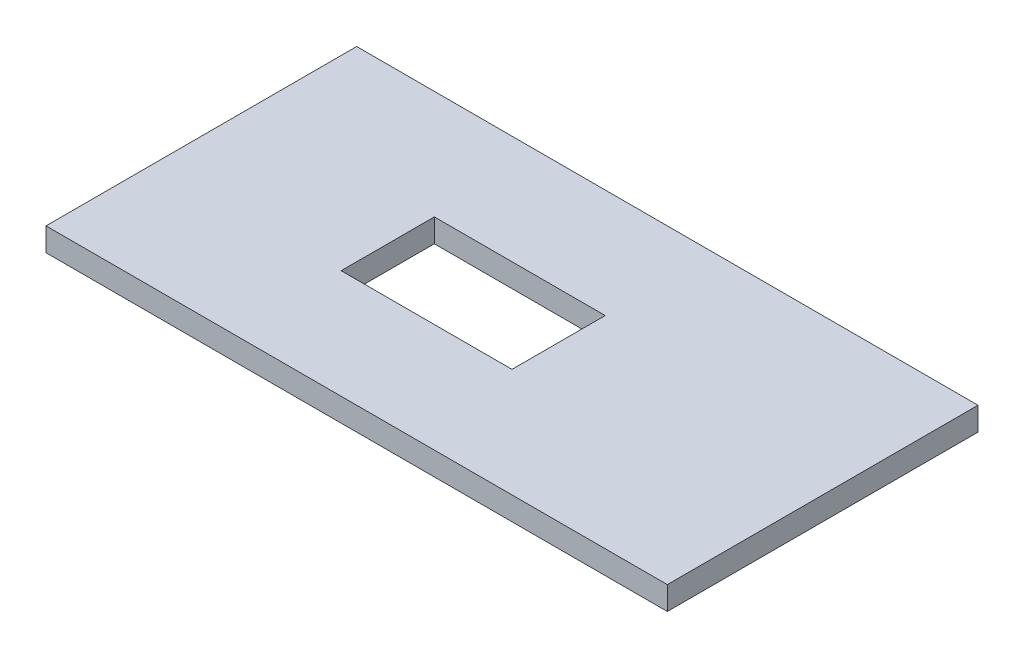
ISO-10303-21;
HEADER;
FILE_DESCRIPTION(('STEP AP214'),'2;1');
FILE_NAME('part.step','',(''),(''),'','','');
FILE_SCHEMA(('AUTOMOTIVE_DESIGN { 1 0 10303 214 1 1 1 1 }'));
ENDSEC;
DATA;
#1=APPLICATION_CONTEXT('core data for automotive mechanical design processes');
#2=APPLICATION_PROTOCOL_DEFINITION('international standard','automotive_design',2000,#1);
#3=PRODUCT_CONTEXT('',#1,'mechanical');
#4=PRODUCT('Part','Part','',(#3));
#5=PRODUCT_RELATED_PRODUCT_CATEGORY('part','',(#4));
#6=PRODUCT_DEFINITION_FORMATION('','',#4);
#7=PRODUCT_DEFINITION_CONTEXT('part definition',#1,'design');
#8=PRODUCT_DEFINITION('design','',#6,#7);
#9=PRODUCT_DEFINITION_SHAPE('','',#8);
#10=(LENGTH_UNIT() NAMED_UNIT(*) SI_UNIT(.MILLI.,.METRE.));
#11=(NAMED_UNIT(*) PLANE_ANGLE_UNIT() SI_UNIT($,.RADIAN.));
#12=(NAMED_UNIT(*) SI_UNIT($,.STERADIAN.) SOLID_ANGLE_UNIT());
#13=UNCERTAINTY_MEASURE_WITH_UNIT(LENGTH_MEASURE(1.E-05),#10,'distance_accuracy_value','');
#14=(GEOMETRIC_REPRESENTATION_CONTEXT(3) GLOBAL_UNCERTAINTY_ASSIGNED_CONTEXT((#13)) GLOBAL_UNIT_ASSIGNED_CONTEXT((#10,
#11,#12)) REPRESENTATION_CONTEXT('',''));
#15=CARTESIAN_POINT('',(0.,0.,0.));
#16=DIRECTION('',(0.,0.,1.));
#17=DIRECTION('',(1.,0.,0.));
#18=AXIS2_PLACEMENT_3D('',#15,#16,#17);
#19=CARTESIAN_POINT('',(0.,3.,0.));
#20=DIRECTION('',(0.,1.,0.));
#21=DIRECTION('',(0.,0.,1.));
#22=AXIS2_PLACEMENT_3D('',#19,#20,#21);
#23=PLANE('',#22);
#24=DIRECTION('',(0.,0.,1.));
#25=VECTOR('',#24,1.);
#26=CARTESIAN_POINT('',(0.,3.,-40.));
#27=LINE('',#26,#25);
#28=CARTESIAN_POINT('',(0.,3.,-40.));
#29=VERTEX_POINT('',#28);
#30=CARTESIAN_POINT('',(0.,3.,0.));
#31=VERTEX_POINT('',#30);
#32=EDGE_CURVE('E134',#29,#31,#27,.T.);
#33=ORIENTED_EDGE('',*,*,#32,.T.);
#34=DIRECTION('',(1.,0.,0.));
#35=VECTOR('',#34,1.);
#36=CARTESIAN_POINT('',(0.,3.,0.));
#37=LINE('',#36,#35);
#38=CARTESIAN_POINT('',(80.,3.,0.));
#39=VERTEX_POINT('',#38);
#40=EDGE_CURVE('E137',#31,#39,#37,.T.);
#41=ORIENTED_EDGE('',*,*,#40,.T.);
#42=DIRECTION('',(0.,0.,-1.));
#43=VECTOR('',#42,1.);
#44=CARTESIAN_POINT('',(80.,3.,-40.));
#45=LINE('',#44,#43);
#46=CARTESIAN_POINT('',(80.,3.,-40.));
#47=VERTEX_POINT('',#46);
#48=EDGE_CURVE('E140',#39,#47,#45,.T.);
#49=ORIENTED_EDGE('',*,*,#48,.T.);
#50=DIRECTION('',(-1.,0.,0.));
#51=VECTOR('',#50,1.);
#52=CARTESIAN_POINT('',(0.,3.,-40.));
#53=LINE('',#52,#51);
#54=EDGE_CURVE('E142',#47,#29,#53,.T.);
#55=ORIENTED_EDGE('',*,*,#54,.T.);
#56=EDGE_LOOP('',(#33,#41,#49,#55));
#57=FACE_BOUND('',#56,.T.);
#58=DIRECTION('',(1.,0.,0.));
#59=VECTOR('',#58,1.);
#60=CARTESIAN_POINT('',(24.,3.,-14.));
#61=LINE('',#60,#59);
#62=CARTESIAN_POINT('',(24.,3.,-14.));
#63=VERTEX_POINT('',#62);
#64=CARTESIAN_POINT('',(46.,3.,-14.));
#65=VERTEX_POINT('',#64);
#66=EDGE_CURVE('E106',#63,#65,#61,.T.);
#67=ORIENTED_EDGE('',*,*,#66,.F.);
#68=DIRECTION('',(0.,0.,1.));
#69=VECTOR('',#68,1.);
#70=CARTESIAN_POINT('',(24.,3.,-26.));
#71=LINE('',#70,#69);
#72=CARTESIAN_POINT('',(24.,3.,-26.));
#73=VERTEX_POINT('',#72);
#74=EDGE_CURVE('E98',#73,#63,#71,.T.);
#75=ORIENTED_EDGE('',*,*,#74,.F.);
#76=DIRECTION('',(-1.,0.,0.));
#77=VECTOR('',#76,1.);
#78=CARTESIAN_POINT('',(24.,3.,-26.));
#79=LINE('',#78,#77);
#80=CARTESIAN_POINT('',(46.,3.,-26.));
#81=VERTEX_POINT('',#80);
#82=EDGE_CURVE('E120',#81,#73,#79,.T.);
#83=ORIENTED_EDGE('',*,*,#82,.F.);
#84=DIRECTION('',(0.,0.,-1.));
#85=VECTOR('',#84,1.);
#86=CARTESIAN_POINT('',(46.,3.,-26.));
#87=LINE('',#86,#85);
#88=EDGE_CURVE('E118',#65,#81,#87,.T.);
#89=ORIENTED_EDGE('',*,*,#88,.F.);
#90=EDGE_LOOP('',(#67,#75,#83,#89));
#91=FACE_BOUND('',#90,.T.);
#92=ADVANCED_FACE('F33',(#57,#91),#23,.T.);
#93=CARTESIAN_POINT('',(0.,0.,0.));
#94=DIRECTION('',(0.,1.,0.));
#95=DIRECTION('',(0.,0.,1.));
#96=AXIS2_PLACEMENT_3D('',#93,#94,#95);
#97=PLANE('',#96);
#98=DIRECTION('',(0.,0.,1.));
#99=VECTOR('',#98,1.);
#100=CARTESIAN_POINT('',(0.,0.,-40.));
#101=LINE('',#100,#99);
#102=CARTESIAN_POINT('',(0.,0.,-40.));
#103=VERTEX_POINT('',#102);
#104=CARTESIAN_POINT('',(0.,0.,0.));
#105=VERTEX_POINT('',#104);
#106=EDGE_CURVE('E114',#103,#105,#101,.T.);
#107=ORIENTED_EDGE('',*,*,#106,.F.);
#108=DIRECTION('',(-1.,0.,0.));
#109=VECTOR('',#108,1.);
#110=CARTESIAN_POINT('',(0.,0.,-40.));
#111=LINE('',#110,#109);
#112=CARTESIAN_POINT('',(80.,0.,-40.));
#113=VERTEX_POINT('',#112);
#114=EDGE_CURVE('E138',#113,#103,#111,.T.);
#115=ORIENTED_EDGE('',*,*,#114,.F.);
#116=DIRECTION('',(0.,0.,-1.));
#117=VECTOR('',#116,1.);
#118=CARTESIAN_POINT('',(80.,0.,-40.));
#119=LINE('',#118,#117);
#120=CARTESIAN_POINT('',(80.,0.,0.));
#121=VERTEX_POINT('',#120);
#122=EDGE_CURVE('E149',#121,#113,#119,.T.);
#123=ORIENTED_EDGE('',*,*,#122,.F.);
#124=DIRECTION('',(1.,0.,0.));
#125=VECTOR('',#124,1.);
#126=CARTESIAN_POINT('',(0.,0.,0.));
#127=LINE('',#126,#125);
#128=EDGE_CURVE('E147',#105,#121,#127,.T.);
#129=ORIENTED_EDGE('',*,*,#128,.F.);
#130=EDGE_LOOP('',(#107,#115,#123,#129));
#131=FACE_BOUND('',#130,.T.);
#132=DIRECTION('',(0.,0.,1.));
#133=VECTOR('',#132,1.);
#134=CARTESIAN_POINT('',(24.,0.,-26.));
#135=LINE('',#134,#133);
#136=CARTESIAN_POINT('',(24.,0.,-26.));
#137=VERTEX_POINT('',#136);
#138=CARTESIAN_POINT('',(24.,0.,-14.));
#139=VERTEX_POINT('',#138);
#140=EDGE_CURVE('E56',#137,#139,#135,.T.);
#141=ORIENTED_EDGE('',*,*,#140,.T.);
#142=DIRECTION('',(1.,0.,0.));
#143=VECTOR('',#142,1.);
#144=CARTESIAN_POINT('',(24.,0.,-14.));
#145=LINE('',#144,#143);
#146=CARTESIAN_POINT('',(46.,0.,-14.));
#147=VERTEX_POINT('',#146);
#148=EDGE_CURVE('E113',#139,#147,#145,.T.);
#149=ORIENTED_EDGE('',*,*,#148,.T.);
#150=DIRECTION('',(0.,0.,-1.));
#151=VECTOR('',#150,1.);
#152=CARTESIAN_POINT('',(46.,0.,-26.));
#153=LINE('',#152,#151);
#154=CARTESIAN_POINT('',(46.,0.,-26.));
#155=VERTEX_POINT('',#154);
#156=EDGE_CURVE('E126',#147,#155,#153,.T.);
#157=ORIENTED_EDGE('',*,*,#156,.T.);
#158=DIRECTION('',(-1.,0.,0.));
#159=VECTOR('',#158,1.);
#160=CARTESIAN_POINT('',(24.,0.,-26.));
#161=LINE('',#160,#159);
#162=EDGE_CURVE('E107',#155,#137,#161,.T.);
#163=ORIENTED_EDGE('',*,*,#162,.T.);
#164=EDGE_LOOP('',(#141,#149,#157,#163));
#165=FACE_BOUND('',#164,.T.);
#166=ADVANCED_FACE('F167',(#131,#165),#97,.F.);
#167=CARTESIAN_POINT('',(0.,3.,-40.));
#168=DIRECTION('',(1.,0.,0.));
#169=DIRECTION('',(0.,0.,-1.));
#170=AXIS2_PLACEMENT_3D('',#167,#168,#169);
#171=PLANE('',#170);
#172=ORIENTED_EDGE('',*,*,#106,.T.);
#173=DIRECTION('',(0.,-1.,0.));
#174=VECTOR('',#173,1.);
#175=CARTESIAN_POINT('',(0.,3.,0.));
#176=LINE('',#175,#174);
#177=EDGE_CURVE('E11',#31,#105,#176,.T.);
#178=ORIENTED_EDGE('',*,*,#177,.F.);
#179=ORIENTED_EDGE('',*,*,#32,.F.);
#180=DIRECTION('',(0.,-1.,0.));
#181=VECTOR('',#180,1.);
#182=CARTESIAN_POINT('',(0.,3.,-40.));
#183=LINE('',#182,#181);
#184=EDGE_CURVE('E144',#29,#103,#183,.T.);
#185=ORIENTED_EDGE('',*,*,#184,.T.);
#186=EDGE_LOOP('',(#172,#178,#179,#185));
#187=FACE_BOUND('',#186,.T.);
#188=ADVANCED_FACE('F35',(#187),#171,.F.);
#189=CARTESIAN_POINT('',(0.,3.,0.));
#190=DIRECTION('',(0.,0.,-1.));
#191=DIRECTION('',(-1.,0.,0.));
#192=AXIS2_PLACEMENT_3D('',#189,#190,#191);
#193=PLANE('',#192);
#194=ORIENTED_EDGE('',*,*,#128,.T.);
#195=DIRECTION('',(0.,-1.,0.));
#196=VECTOR('',#195,1.);
#197=CARTESIAN_POINT('',(80.,3.,0.));
#198=LINE('',#197,#196);
#199=EDGE_CURVE('E41',#39,#121,#198,.T.);
#200=ORIENTED_EDGE('',*,*,#199,.F.);
#201=ORIENTED_EDGE('',*,*,#40,.F.);
#202=ORIENTED_EDGE('',*,*,#177,.T.);
#203=EDGE_LOOP('',(#194,#200,#201,#202));
#204=FACE_BOUND('',#203,.T.);
#205=ADVANCED_FACE('F177',(#204),#193,.F.);
#206=CARTESIAN_POINT('',(80.,3.,-40.));
#207=DIRECTION('',(-1.,0.,0.));
#208=DIRECTION('',(0.,0.,1.));
#209=AXIS2_PLACEMENT_3D('',#206,#207,#208);
#210=PLANE('',#209);
#211=ORIENTED_EDGE('',*,*,#122,.T.);
#212=DIRECTION('',(0.,-1.,0.));
#213=VECTOR('',#212,1.);
#214=CARTESIAN_POINT('',(80.,3.,-40.));
#215=LINE('',#214,#213);
#216=EDGE_CURVE('E154',#47,#113,#215,.T.);
#217=ORIENTED_EDGE('',*,*,#216,.F.);
#218=ORIENTED_EDGE('',*,*,#48,.F.);
#219=ORIENTED_EDGE('',*,*,#199,.T.);
#220=EDGE_LOOP('',(#211,#217,#218,#219));
#221=FACE_BOUND('',#220,.T.);
#222=ADVANCED_FACE('F161',(#221),#210,.F.);
#223=CARTESIAN_POINT('',(0.,3.,-40.));
#224=DIRECTION('',(0.,0.,1.));
#225=DIRECTION('',(1.,0.,0.));
#226=AXIS2_PLACEMENT_3D('',#223,#224,#225);
#227=PLANE('',#226);
#228=ORIENTED_EDGE('',*,*,#114,.T.);
#229=ORIENTED_EDGE('',*,*,#184,.F.);
#230=ORIENTED_EDGE('',*,*,#54,.F.);
#231=ORIENTED_EDGE('',*,*,#216,.T.);
#232=EDGE_LOOP('',(#228,#229,#230,#231));
#233=FACE_BOUND('',#232,.T.);
#234=ADVANCED_FACE('F171',(#233),#227,.F.);
#235=CARTESIAN_POINT('',(24.,3.,-26.));
#236=DIRECTION('',(1.,0.,0.));
#237=DIRECTION('',(0.,0.,-1.));
#238=AXIS2_PLACEMENT_3D('',#235,#236,#237);
#239=PLANE('',#238);
#240=ORIENTED_EDGE('',*,*,#140,.F.);
#241=DIRECTION('',(0.,-1.,0.));
#242=VECTOR('',#241,1.);
#243=CARTESIAN_POINT('',(24.,3.,-26.));
#244=LINE('',#243,#242);
#245=EDGE_CURVE('E102',#73,#137,#244,.T.);
#246=ORIENTED_EDGE('',*,*,#245,.F.);
#247=ORIENTED_EDGE('',*,*,#74,.T.);
#248=DIRECTION('',(0.,-1.,0.));
#249=VECTOR('',#248,1.);
#250=CARTESIAN_POINT('',(24.,3.,-14.));
#251=LINE('',#250,#249);
#252=EDGE_CURVE('E101',#63,#139,#251,.T.);
#253=ORIENTED_EDGE('',*,*,#252,.T.);
#254=EDGE_LOOP('',(#240,#246,#247,#253));
#255=FACE_BOUND('',#254,.T.);
#256=ADVANCED_FACE('F100',(#255),#239,.T.);
#257=CARTESIAN_POINT('',(24.,3.,-14.));
#258=DIRECTION('',(0.,0.,-1.));
#259=DIRECTION('',(-1.,0.,0.));
#260=AXIS2_PLACEMENT_3D('',#257,#258,#259);
#261=PLANE('',#260);
#262=ORIENTED_EDGE('',*,*,#148,.F.);
#263=ORIENTED_EDGE('',*,*,#252,.F.);
#264=ORIENTED_EDGE('',*,*,#66,.T.);
#265=DIRECTION('',(0.,-1.,0.));
#266=VECTOR('',#265,1.);
#267=CARTESIAN_POINT('',(46.,3.,-14.));
#268=LINE('',#267,#266);
#269=EDGE_CURVE('E115',#65,#147,#268,.T.);
#270=ORIENTED_EDGE('',*,*,#269,.T.);
#271=EDGE_LOOP('',(#262,#263,#264,#270));
#272=FACE_BOUND('',#271,.T.);
#273=ADVANCED_FACE('F110',(#272),#261,.T.);
#274=CARTESIAN_POINT('',(46.,3.,-26.));
#275=DIRECTION('',(-1.,0.,0.));
#276=DIRECTION('',(0.,0.,1.));
#277=AXIS2_PLACEMENT_3D('',#274,#275,#276);
#278=PLANE('',#277);
#279=ORIENTED_EDGE('',*,*,#156,.F.);
#280=ORIENTED_EDGE('',*,*,#269,.F.);
#281=ORIENTED_EDGE('',*,*,#88,.T.);
#282=DIRECTION('',(0.,-1.,0.));
#283=VECTOR('',#282,1.);
#284=CARTESIAN_POINT('',(46.,3.,-26.));
#285=LINE('',#284,#283);
#286=EDGE_CURVE('E48',#81,#155,#285,.T.);
#287=ORIENTED_EDGE('',*,*,#286,.T.);
#288=EDGE_LOOP('',(#279,#280,#281,#287));
#289=FACE_BOUND('',#288,.T.);
#290=ADVANCED_FACE('F200',(#289),#278,.T.);
#291=CARTESIAN_POINT('',(24.,3.,-26.));
#292=DIRECTION('',(0.,0.,1.));
#293=DIRECTION('',(1.,0.,0.));
#294=AXIS2_PLACEMENT_3D('',#291,#292,#293);
#295=PLANE('',#294);
#296=ORIENTED_EDGE('',*,*,#162,.F.);
#297=ORIENTED_EDGE('',*,*,#286,.F.);
#298=ORIENTED_EDGE('',*,*,#82,.T.);
#299=ORIENTED_EDGE('',*,*,#245,.T.);
#300=EDGE_LOOP('',(#296,#297,#298,#299));
#301=FACE_BOUND('',#300,.T.);
#302=ADVANCED_FACE('F204',(#301),#295,.T.);
#303=CLOSED_SHELL('',(#92,#166,#188,#205,#222,#234,#256,#273,#290,#302));
#304=MANIFOLD_SOLID_BREP('B2',#303);
#305=ADVANCED_BREP_SHAPE_REPRESENTATION('',(#18,#304),#14);
#306=SHAPE_DEFINITION_REPRESENTATION(#9,#305);
ENDSEC;
END-ISO-10303-21;
